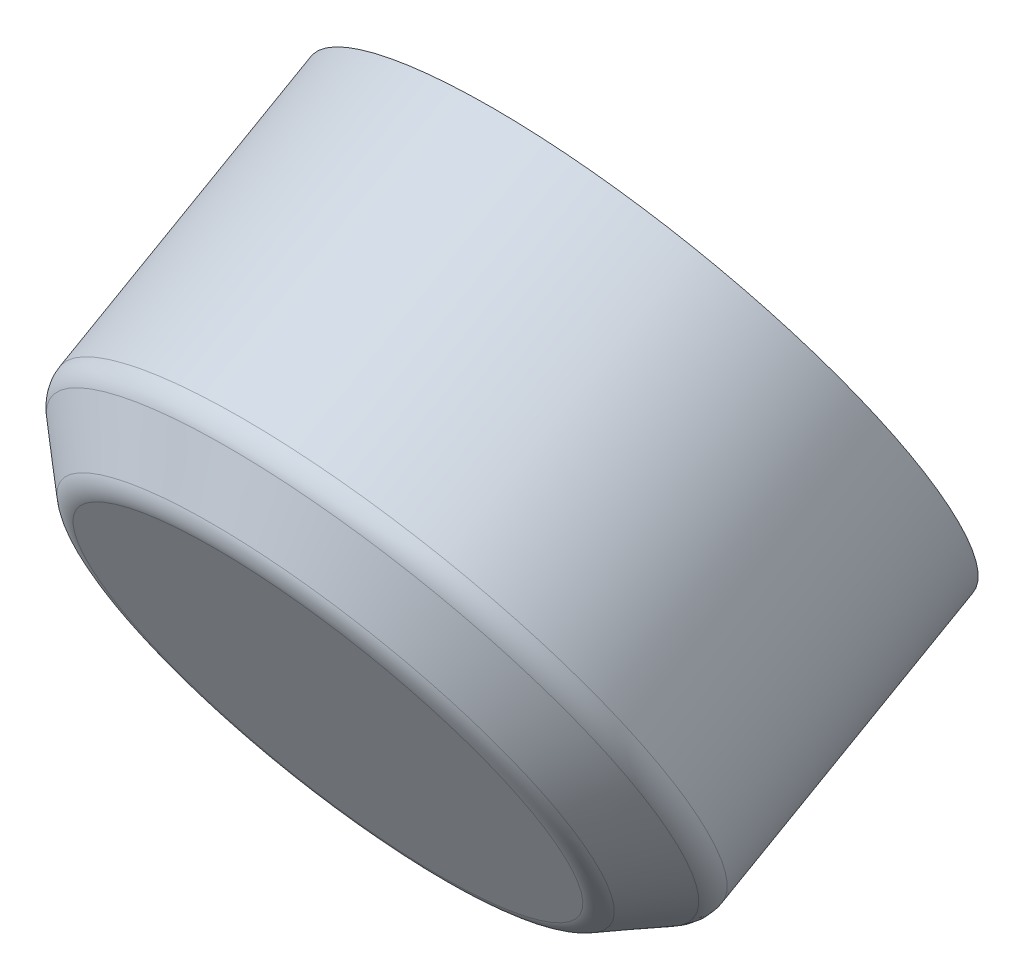
ISO-10303-21;
HEADER;
FILE_DESCRIPTION(('STEP AP214'),'2;1');
FILE_NAME('part.step','',(''),(''),'','','');
FILE_SCHEMA(('AUTOMOTIVE_DESIGN { 1 0 10303 214 1 1 1 1 }'));
ENDSEC;
DATA;
#1=APPLICATION_CONTEXT('core data for automotive mechanical design processes');
#2=APPLICATION_PROTOCOL_DEFINITION('international standard','automotive_design',2000,#1);
#3=PRODUCT_CONTEXT('',#1,'mechanical');
#4=PRODUCT('Part','Part','',(#3));
#5=PRODUCT_RELATED_PRODUCT_CATEGORY('part','',(#4));
#6=PRODUCT_DEFINITION_FORMATION('','',#4);
#7=PRODUCT_DEFINITION_CONTEXT('part definition',#1,'design');
#8=PRODUCT_DEFINITION('design','',#6,#7);
#9=PRODUCT_DEFINITION_SHAPE('','',#8);
#10=(LENGTH_UNIT() NAMED_UNIT(*) SI_UNIT(.MILLI.,.METRE.));
#11=(NAMED_UNIT(*) PLANE_ANGLE_UNIT() SI_UNIT($,.RADIAN.));
#12=(NAMED_UNIT(*) SI_UNIT($,.STERADIAN.) SOLID_ANGLE_UNIT());
#13=UNCERTAINTY_MEASURE_WITH_UNIT(LENGTH_MEASURE(1.E-05),#10,'distance_accuracy_value','');
#14=(GEOMETRIC_REPRESENTATION_CONTEXT(3) GLOBAL_UNCERTAINTY_ASSIGNED_CONTEXT((#13)) GLOBAL_UNIT_ASSIGNED_CONTEXT((#10,
#11,#12)) REPRESENTATION_CONTEXT('',''));
#15=CARTESIAN_POINT('',(0.,0.,0.));
#16=DIRECTION('',(0.,0.,1.));
#17=DIRECTION('',(1.,0.,0.));
#18=AXIS2_PLACEMENT_3D('',#15,#16,#17);
#19=CARTESIAN_POINT('',(0.,26.5724826817115,58.774079964931));
#20=DIRECTION('',(0.,0.494736971942381,-0.869042765687215));
#21=DIRECTION('',(0.,0.869042765687215,0.494736971942381));
#22=AXIS2_PLACEMENT_3D('',#19,#20,#21);
#23=CYLINDRICAL_SURFACE('',#22,4.);
#24=CARTESIAN_POINT('',(0.,30.0356414853082,52.6907806051205));
#25=DIRECTION('',(0.,0.494736971942381,-0.869042765687215));
#26=DIRECTION('',(0.,0.869042765687215,0.494736971942381));
#27=AXIS2_PLACEMENT_3D('',#24,#25,#26);
#28=CIRCLE('',#27,4.);
#29=CARTESIAN_POINT('',(0.,33.5118125480571,54.66972849289));
#30=VERTEX_POINT('',#29);
#31=EDGE_CURVE('E131',#30,#30,#28,.T.);
#32=ORIENTED_EDGE('',*,*,#31,.T.);
#33=EDGE_LOOP('',(#32));
#34=FACE_BOUND('',#33,.T.);
#35=CARTESIAN_POINT('',(0.,28.9224832984378,54.6461268279167));
#36=DIRECTION('',(0.,-0.494736971942379,0.869042765687216));
#37=DIRECTION('',(0.,-0.869042765687216,-0.494736971942379));
#38=AXIS2_PLACEMENT_3D('',#35,#36,#37);
#39=CIRCLE('',#38,4.);
#40=CARTESIAN_POINT('',(0.,25.446312235689,52.6671789401472));
#41=VERTEX_POINT('',#40);
#42=EDGE_CURVE('E144',#41,#41,#39,.F.);
#43=ORIENTED_EDGE('',*,*,#42,.F.);
#44=EDGE_LOOP('',(#43));
#45=FACE_BOUND('',#44,.T.);
#46=ADVANCED_FACE('F45',(#34,#45),#23,.F.);
#47=CARTESIAN_POINT('',(0.,30.0356414853082,52.6907806051205));
#48=DIRECTION('',(0.,-0.494736971942381,0.869042765687215));
#49=DIRECTION('',(0.,-0.869042765687215,-0.494736971942381));
#50=AXIS2_PLACEMENT_3D('',#47,#48,#49);
#51=CYLINDRICAL_SURFACE('',#50,10.);
#52=CARTESIAN_POINT('',(0.,25.2931985294703,61.0212389621628));
#53=DIRECTION('',(0.,-0.494736971942381,0.869042765687215));
#54=DIRECTION('',(0.,-0.869042765687215,-0.494736971942381));
#55=AXIS2_PLACEMENT_3D('',#52,#53,#54);
#56=CIRCLE('',#55,10.);
#57=CARTESIAN_POINT('',(0.,16.6027708725982,56.073869242739));
#58=VERTEX_POINT('',#57);
#59=EDGE_CURVE('E137',#58,#58,#56,.F.);
#60=ORIENTED_EDGE('',*,*,#59,.T.);
#61=EDGE_LOOP('',(#60));
#62=FACE_BOUND('',#61,.T.);
#63=CARTESIAN_POINT('',(0.,30.0356414853082,52.6907806051205));
#64=DIRECTION('',(0.,-0.494736971942381,0.869042765687215));
#65=DIRECTION('',(0.,-0.869042765687215,-0.494736971942381));
#66=AXIS2_PLACEMENT_3D('',#63,#64,#65);
#67=CIRCLE('',#66,10.);
#68=CARTESIAN_POINT('',(0.,21.3452138284361,47.7434108856967));
#69=VERTEX_POINT('',#68);
#70=EDGE_CURVE('E134',#69,#69,#67,.T.);
#71=ORIENTED_EDGE('',*,*,#70,.T.);
#72=EDGE_LOOP('',(#71));
#73=FACE_BOUND('',#72,.T.);
#74=ADVANCED_FACE('F199',(#62,#73),#51,.T.);
#75=CARTESIAN_POINT('',(0.,30.0356414853082,52.6907806051205));
#76=DIRECTION('',(0.,-0.494736971942381,0.869042765687215));
#77=DIRECTION('',(0.,-0.869042765687215,-0.494736971942381));
#78=AXIS2_PLACEMENT_3D('',#75,#76,#77);
#79=PLANE('',#78);
#80=ORIENTED_EDGE('',*,*,#31,.F.);
#81=EDGE_LOOP('',(#80));
#82=FACE_BOUND('',#81,.T.);
#83=ORIENTED_EDGE('',*,*,#70,.F.);
#84=EDGE_LOOP('',(#83));
#85=FACE_BOUND('',#84,.T.);
#86=ADVANCED_FACE('F207',(#82,#85),#79,.F.);
#87=CARTESIAN_POINT('',(0.,24.0987978219996,63.1192937933671));
#88=DIRECTION('',(0.,-0.494736971942381,0.869042765687215));
#89=DIRECTION('',(0.,-0.869042765687215,-0.494736971942381));
#90=AXIS2_PLACEMENT_3D('',#87,#88,#89);
#91=PLANE('',#90);
#92=CARTESIAN_POINT('',(0.,24.0987978219996,63.1192937933671));
#93=DIRECTION('',(0.,-0.494736971942381,0.869042765687215));
#94=DIRECTION('',(0.,-0.869042765687215,-0.494736971942381));
#95=AXIS2_PLACEMENT_3D('',#92,#93,#94);
#96=CIRCLE('',#95,7.58578643762691);
#97=CARTESIAN_POINT('',(0.,17.5064249963318,59.366324781414));
#98=VERTEX_POINT('',#97);
#99=EDGE_CURVE('E11',#98,#98,#96,.T.);
#100=ORIENTED_EDGE('',*,*,#99,.T.);
#101=EDGE_LOOP('',(#100));
#102=FACE_BOUND('',#101,.T.);
#103=ADVANCED_FACE('F219',(#102),#91,.T.);
#104=CARTESIAN_POINT('',(0.,24.0987978219996,63.1192937933671));
#105=DIRECTION('',(0.,0.494736971942381,-0.869042765687215));
#106=DIRECTION('',(0.,0.869042765687215,0.494736971942381));
#107=AXIS2_PLACEMENT_3D('',#104,#105,#106);
#108=CONICAL_SURFACE('',#107,8.,0.785398163397443);
#109=CARTESIAN_POINT('',(0.,24.9433666617062,61.6357449949213));
#110=DIRECTION('',(0.,-0.494736971942381,0.869042765687215));
#111=DIRECTION('',(0.,-0.869042765687215,-0.494736971942381));
#112=AXIS2_PLACEMENT_3D('',#109,#110,#111);
#113=CIRCLE('',#112,9.70710678118656);
#114=CARTESIAN_POINT('',(0.,16.5074757377627,56.8332803796757));
#115=VERTEX_POINT('',#114);
#116=EDGE_CURVE('E55',#115,#115,#113,.T.);
#117=ORIENTED_EDGE('',*,*,#116,.T.);
#118=EDGE_LOOP('',(#117));
#119=FACE_BOUND('',#118,.T.);
#120=CARTESIAN_POINT('',(0.,24.2437029261779,62.8647570604384));
#121=DIRECTION('',(0.,-0.494736971942381,0.869042765687215));
#122=DIRECTION('',(0.,-0.869042765687215,-0.494736971942381));
#123=AXIS2_PLACEMENT_3D('',#120,#121,#122);
#124=CIRCLE('',#123,8.29289321881346);
#125=CARTESIAN_POINT('',(0.,17.0368240677515,58.7619561807211));
#126=VERTEX_POINT('',#125);
#127=EDGE_CURVE('E140',#126,#126,#124,.F.);
#128=ORIENTED_EDGE('',*,*,#127,.T.);
#129=EDGE_LOOP('',(#128));
#130=FACE_BOUND('',#129,.T.);
#131=ADVANCED_FACE('F222',(#119,#130),#108,.T.);
#132=CARTESIAN_POINT('',(0.,25.2931985294703,61.0212389621628));
#133=DIRECTION('',(0.,-0.494736971942381,0.869042765687215));
#134=DIRECTION('',(0.,-0.869042765687215,-0.494736971942381));
#135=AXIS2_PLACEMENT_3D('',#132,#133,#134);
#136=TOROIDAL_SURFACE('',#135,9.00000000000001,1.);
#137=ORIENTED_EDGE('',*,*,#116,.F.);
#138=EDGE_LOOP('',(#137));
#139=FACE_BOUND('',#138,.T.);
#140=ORIENTED_EDGE('',*,*,#59,.F.);
#141=EDGE_LOOP('',(#140));
#142=FACE_BOUND('',#141,.T.);
#143=ADVANCED_FACE('F231',(#139,#142),#136,.T.);
#144=CARTESIAN_POINT('',(0.,24.593534793942,62.2502510276799));
#145=DIRECTION('',(0.,-0.494736971942381,0.869042765687215));
#146=DIRECTION('',(0.,-0.869042765687215,-0.494736971942381));
#147=AXIS2_PLACEMENT_3D('',#144,#145,#146);
#148=TOROIDAL_SURFACE('',#147,7.58578643762691,1.);
#149=ORIENTED_EDGE('',*,*,#127,.F.);
#150=EDGE_LOOP('',(#149));
#151=FACE_BOUND('',#150,.T.);
#152=ORIENTED_EDGE('',*,*,#99,.F.);
#153=EDGE_LOOP('',(#152));
#154=FACE_BOUND('',#153,.T.);
#155=ADVANCED_FACE('F47',(#151,#154),#148,.T.);
#156=CARTESIAN_POINT('',(0.,-16.4157682141171,28.835533664822));
#157=DIRECTION('',(0.,-0.494736971942379,0.869042765687216));
#158=DIRECTION('',(0.,-0.869042765687216,-0.494736971942379));
#159=AXIS2_PLACEMENT_3D('',#156,#157,#158);
#160=PLANE('',#159);
#161=DIRECTION('',(0.,0.869042765687216,0.494736971942379));
#162=VECTOR('',#161,1.);
#163=CARTESIAN_POINT('',(6.31217782649106,25.8808336185326,52.9145474261184));
#164=LINE('',#163,#162);
#165=CARTESIAN_POINT('',(6.31217782649106,25.7553980998559,52.8431382951362));
#166=VERTEX_POINT('',#165);
#167=CARTESIAN_POINT('',(6.31217782649106,32.0895684970198,56.4491153606973));
#168=VERTEX_POINT('',#167);
#169=EDGE_CURVE('E99',#166,#168,#164,.T.);
#170=ORIENTED_EDGE('',*,*,#169,.T.);
#171=DIRECTION('',(-0.866025403784439,0.434521382843608,0.247368485971189));
#172=VECTOR('',#171,1.);
#173=CARTESIAN_POINT('',(6.18717782649106,32.1522862563582,56.4848199261884));
#174=LINE('',#173,#172);
#175=CARTESIAN_POINT('',(0.,35.2566536956018,58.2521038934779));
#176=VERTEX_POINT('',#175);
#177=EDGE_CURVE('E89',#168,#176,#174,.T.);
#178=ORIENTED_EDGE('',*,*,#177,.T.);
#179=DIRECTION('',(-0.866025403784439,-0.434521382843608,-0.24736848597119));
#180=VECTOR('',#179,1.);
#181=CARTESIAN_POINT('',(-0.124999999999999,35.1939359362634,58.2163993279868));
#182=LINE('',#181,#180);
#183=CARTESIAN_POINT('',(-6.31217782649106,32.0895684970198,56.4491153606973));
#184=VERTEX_POINT('',#183);
#185=EDGE_CURVE('E96',#176,#184,#182,.T.);
#186=ORIENTED_EDGE('',*,*,#185,.T.);
#187=DIRECTION('',(0.,-0.869042765687216,-0.494736971942379));
#188=VECTOR('',#187,1.);
#189=CARTESIAN_POINT('',(-6.31217782649106,31.9641329783431,56.3777062297151));
#190=LINE('',#189,#188);
#191=CARTESIAN_POINT('',(-6.31217782649106,25.7553980998559,52.8431382951362));
#192=VERTEX_POINT('',#191);
#193=EDGE_CURVE('E117',#184,#192,#190,.T.);
#194=ORIENTED_EDGE('',*,*,#193,.T.);
#195=DIRECTION('',(0.866025403784438,-0.434521382843609,-0.247368485971189));
#196=VECTOR('',#195,1.);
#197=CARTESIAN_POINT('',(-6.18717782649106,25.6926803405175,52.807433729645));
#198=LINE('',#197,#196);
#199=CARTESIAN_POINT('',(0.,22.5883129012739,51.0401497623556));
#200=VERTEX_POINT('',#199);
#201=EDGE_CURVE('E119',#192,#200,#198,.T.);
#202=ORIENTED_EDGE('',*,*,#201,.T.);
#203=DIRECTION('',(0.866025403784439,0.434521382843608,0.24736848597119));
#204=VECTOR('',#203,1.);
#205=CARTESIAN_POINT('',(0.124999999999997,22.6510306606123,51.0758543278467));
#206=LINE('',#205,#204);
#207=EDGE_CURVE('E155',#200,#166,#206,.T.);
#208=ORIENTED_EDGE('',*,*,#207,.T.);
#209=EDGE_LOOP('',(#170,#178,#186,#194,#202,#208));
#210=FACE_BOUND('',#209,.T.);
#211=ORIENTED_EDGE('',*,*,#42,.T.);
#212=EDGE_LOOP('',(#211));
#213=FACE_BOUND('',#212,.T.);
#214=ADVANCED_FACE('F93',(#210,#213),#160,.T.);
#215=CARTESIAN_POINT('',(0.,-20.126295503685,35.3533544074761));
#216=DIRECTION('',(0.,-0.494736971942379,0.869042765687216));
#217=DIRECTION('',(0.,-0.869042765687216,-0.494736971942379));
#218=AXIS2_PLACEMENT_3D('',#215,#216,#217);
#219=PLANE('',#218);
#220=DIRECTION('',(0.,0.869042765687216,0.494736971942379));
#221=VECTOR('',#220,1.);
#222=CARTESIAN_POINT('',(6.31217782649106,22.1703063289647,59.4323681687725));
#223=LINE('',#222,#221);
#224=CARTESIAN_POINT('',(6.31217782649106,22.044870810288,59.3609590377903));
#225=VERTEX_POINT('',#224);
#226=CARTESIAN_POINT('',(6.31217782649106,28.379041207452,62.9669361033514));
#227=VERTEX_POINT('',#226);
#228=EDGE_CURVE('E156',#225,#227,#223,.T.);
#229=ORIENTED_EDGE('',*,*,#228,.F.);
#230=DIRECTION('',(0.866025403784439,0.434521382843608,0.24736848597119));
#231=VECTOR('',#230,1.);
#232=CARTESIAN_POINT('',(0.124999999999996,18.9405033710444,57.5936750705008));
#233=LINE('',#232,#231);
#234=CARTESIAN_POINT('',(0.,18.8777856117061,57.5579705050097));
#235=VERTEX_POINT('',#234);
#236=EDGE_CURVE('E64',#235,#225,#233,.T.);
#237=ORIENTED_EDGE('',*,*,#236,.F.);
#238=DIRECTION('',(0.866025403784438,-0.434521382843609,-0.247368485971189));
#239=VECTOR('',#238,1.);
#240=CARTESIAN_POINT('',(-6.18717782649106,21.9821530509497,59.3252544722992));
#241=LINE('',#240,#239);
#242=CARTESIAN_POINT('',(-6.31217782649106,22.044870810288,59.3609590377903));
#243=VERTEX_POINT('',#242);
#244=EDGE_CURVE('E163',#243,#235,#241,.T.);
#245=ORIENTED_EDGE('',*,*,#244,.F.);
#246=DIRECTION('',(0.,-0.869042765687216,-0.494736971942379));
#247=VECTOR('',#246,1.);
#248=CARTESIAN_POINT('',(-6.31217782649106,28.2536056887753,62.8955269723692));
#249=LINE('',#248,#247);
#250=CARTESIAN_POINT('',(-6.31217782649106,28.379041207452,62.9669361033514));
#251=VERTEX_POINT('',#250);
#252=EDGE_CURVE('E174',#251,#243,#249,.T.);
#253=ORIENTED_EDGE('',*,*,#252,.F.);
#254=DIRECTION('',(-0.866025403784439,-0.434521382843608,-0.24736848597119));
#255=VECTOR('',#254,1.);
#256=CARTESIAN_POINT('',(-0.125000000000001,31.4834086466956,64.7342200706409));
#257=LINE('',#256,#255);
#258=CARTESIAN_POINT('',(0.,31.5461264060339,64.769924636132));
#259=VERTEX_POINT('',#258);
#260=EDGE_CURVE('E177',#259,#251,#257,.T.);
#261=ORIENTED_EDGE('',*,*,#260,.F.);
#262=DIRECTION('',(-0.866025403784439,0.434521382843608,0.247368485971189));
#263=VECTOR('',#262,1.);
#264=CARTESIAN_POINT('',(6.18717782649106,28.4417589667903,63.0026406688426));
#265=LINE('',#264,#263);
#266=EDGE_CURVE('E107',#227,#259,#265,.T.);
#267=ORIENTED_EDGE('',*,*,#266,.F.);
#268=EDGE_LOOP('',(#229,#237,#245,#253,#261,#267));
#269=FACE_BOUND('',#268,.T.);
#270=CARTESIAN_POINT('',(0.,25.21195600887,61.1639475705708));
#271=DIRECTION('',(0.,-0.494736971942379,0.869042765687216));
#272=DIRECTION('',(0.,-0.869042765687216,-0.494736971942379));
#273=AXIS2_PLACEMENT_3D('',#270,#271,#272);
#274=CIRCLE('',#273,3.75000000000001);
#275=CARTESIAN_POINT('',(0.,21.9530456375429,59.3086839257869));
#276=VERTEX_POINT('',#275);
#277=EDGE_CURVE('E167',#276,#276,#274,.T.);
#278=ORIENTED_EDGE('',*,*,#277,.T.);
#279=EDGE_LOOP('',(#278));
#280=FACE_BOUND('',#279,.T.);
#281=ADVANCED_FACE('F182',(#269,#280),#219,.F.);
#282=CARTESIAN_POINT('',(6.31217782649106,22.2939905719503,59.2151074773507));
#283=DIRECTION('',(-1.,0.,0.));
#284=DIRECTION('',(0.,0.,1.));
#285=AXIS2_PLACEMENT_3D('',#282,#283,#284);
#286=PLANE('',#285);
#287=ORIENTED_EDGE('',*,*,#169,.F.);
#288=DIRECTION('',(0.,0.494736971942379,-0.869042765687216));
#289=VECTOR('',#288,1.);
#290=CARTESIAN_POINT('',(6.31217782649106,22.1685550532736,59.1436983463685));
#291=LINE('',#290,#289);
#292=EDGE_CURVE('E130',#225,#166,#291,.T.);
#293=ORIENTED_EDGE('',*,*,#292,.F.);
#294=ORIENTED_EDGE('',*,*,#228,.T.);
#295=DIRECTION('',(0.,0.494736971942379,-0.869042765687216));
#296=VECTOR('',#295,1.);
#297=CARTESIAN_POINT('',(6.31217782649106,28.5027254504375,62.7496754119296));
#298=LINE('',#297,#296);
#299=EDGE_CURVE('E111',#227,#168,#298,.T.);
#300=ORIENTED_EDGE('',*,*,#299,.T.);
#301=EDGE_LOOP('',(#287,#293,#294,#300));
#302=FACE_BOUND('',#301,.T.);
#303=ADVANCED_FACE('F166',(#302),#286,.T.);
#304=CARTESIAN_POINT('',(6.18717782649106,28.5654432097759,62.7853799774208));
#305=DIRECTION('',(-0.5,-0.752613112060217,-0.42845478589349));
#306=DIRECTION('',(0.832939072330605,-0.553364709558742,0.));
#307=AXIS2_PLACEMENT_3D('',#304,#305,#306);
#308=PLANE('',#307);
#309=ORIENTED_EDGE('',*,*,#177,.F.);
#310=ORIENTED_EDGE('',*,*,#299,.F.);
#311=ORIENTED_EDGE('',*,*,#266,.T.);
#312=DIRECTION('',(0.,0.494736971942379,-0.869042765687216));
#313=VECTOR('',#312,1.);
#314=CARTESIAN_POINT('',(0.,31.6698106490195,64.5526639447102));
#315=LINE('',#314,#313);
#316=EDGE_CURVE('E103',#259,#176,#315,.T.);
#317=ORIENTED_EDGE('',*,*,#316,.T.);
#318=EDGE_LOOP('',(#309,#310,#311,#317));
#319=FACE_BOUND('',#318,.T.);
#320=ADVANCED_FACE('F104',(#319),#308,.T.);
#321=CARTESIAN_POINT('',(-0.125000000000001,31.6070928896812,64.5169593792191));
#322=DIRECTION('',(0.5,-0.752613112060217,-0.42845478589349));
#323=DIRECTION('',(0.832939072330605,0.553364709558742,0.));
#324=AXIS2_PLACEMENT_3D('',#321,#322,#323);
#325=PLANE('',#324);
#326=ORIENTED_EDGE('',*,*,#185,.F.);
#327=ORIENTED_EDGE('',*,*,#316,.F.);
#328=ORIENTED_EDGE('',*,*,#260,.T.);
#329=DIRECTION('',(0.,0.494736971942379,-0.869042765687216));
#330=VECTOR('',#329,1.);
#331=CARTESIAN_POINT('',(-6.31217782649106,28.5027254504376,62.7496754119296));
#332=LINE('',#331,#330);
#333=EDGE_CURVE('E112',#251,#184,#332,.T.);
#334=ORIENTED_EDGE('',*,*,#333,.T.);
#335=EDGE_LOOP('',(#326,#327,#328,#334));
#336=FACE_BOUND('',#335,.T.);
#337=ADVANCED_FACE('F114',(#336),#325,.T.);
#338=CARTESIAN_POINT('',(-6.31217782649106,28.3772899317608,62.6782662809474));
#339=DIRECTION('',(1.,0.,0.));
#340=DIRECTION('',(0.,1.,0.));
#341=AXIS2_PLACEMENT_3D('',#338,#339,#340);
#342=PLANE('',#341);
#343=ORIENTED_EDGE('',*,*,#193,.F.);
#344=ORIENTED_EDGE('',*,*,#333,.F.);
#345=ORIENTED_EDGE('',*,*,#252,.T.);
#346=DIRECTION('',(0.,0.494736971942379,-0.869042765687216));
#347=VECTOR('',#346,1.);
#348=CARTESIAN_POINT('',(-6.31217782649106,22.1685550532736,59.1436983463685));
#349=LINE('',#348,#347);
#350=EDGE_CURVE('E124',#243,#192,#349,.T.);
#351=ORIENTED_EDGE('',*,*,#350,.T.);
#352=EDGE_LOOP('',(#343,#344,#345,#351));
#353=FACE_BOUND('',#352,.T.);
#354=ADVANCED_FACE('F188',(#353),#342,.T.);
#355=CARTESIAN_POINT('',(-6.18717782649106,22.1058372939353,59.1079937808774));
#356=DIRECTION('',(0.5,0.752613112060216,0.428454785893489));
#357=DIRECTION('',(-0.832939072330605,0.553364709558742,0.));
#358=AXIS2_PLACEMENT_3D('',#355,#356,#357);
#359=PLANE('',#358);
#360=ORIENTED_EDGE('',*,*,#201,.F.);
#361=ORIENTED_EDGE('',*,*,#350,.F.);
#362=ORIENTED_EDGE('',*,*,#244,.T.);
#363=DIRECTION('',(0.,0.494736971942379,-0.869042765687216));
#364=VECTOR('',#363,1.);
#365=CARTESIAN_POINT('',(0.,19.0014698546917,57.3407098135879));
#366=LINE('',#365,#364);
#367=EDGE_CURVE('E127',#235,#200,#366,.T.);
#368=ORIENTED_EDGE('',*,*,#367,.T.);
#369=EDGE_LOOP('',(#360,#361,#362,#368));
#370=FACE_BOUND('',#369,.T.);
#371=ADVANCED_FACE('F161',(#370),#359,.T.);
#372=CARTESIAN_POINT('',(0.124999999999996,19.06418761403,57.376414379079));
#373=DIRECTION('',(-0.5,0.752613112060217,0.42845478589349));
#374=DIRECTION('',(-0.832939072330605,-0.553364709558742,0.));
#375=AXIS2_PLACEMENT_3D('',#372,#373,#374);
#376=PLANE('',#375);
#377=ORIENTED_EDGE('',*,*,#207,.F.);
#378=ORIENTED_EDGE('',*,*,#367,.F.);
#379=ORIENTED_EDGE('',*,*,#236,.T.);
#380=ORIENTED_EDGE('',*,*,#292,.T.);
#381=EDGE_LOOP('',(#377,#378,#379,#380));
#382=FACE_BOUND('',#381,.T.);
#383=ADVANCED_FACE('F164',(#382),#376,.T.);
#384=CARTESIAN_POINT('',(0.,25.3356402518556,60.946686879149));
#385=DIRECTION('',(0.,0.494736971942379,-0.869042765687216));
#386=DIRECTION('',(0.,0.869042765687216,0.494736971942379));
#387=AXIS2_PLACEMENT_3D('',#384,#385,#386);
#388=CYLINDRICAL_SURFACE('',#387,3.75000000000001);
#389=CARTESIAN_POINT('',(0.,25.3356402518556,60.946686879149));
#390=DIRECTION('',(0.,0.49473697194238,-0.869042765687216));
#391=DIRECTION('',(0.,0.869042765687216,0.49473697194238));
#392=AXIS2_PLACEMENT_3D('',#389,#390,#391);
#393=CIRCLE('',#392,3.75000000000001);
#394=CARTESIAN_POINT('',(0.,28.5945506231826,62.801950523933));
#395=VERTEX_POINT('',#394);
#396=EDGE_CURVE('E49',#395,#395,#393,.F.);
#397=ORIENTED_EDGE('',*,*,#396,.T.);
#398=EDGE_LOOP('',(#397));
#399=FACE_BOUND('',#398,.T.);
#400=ORIENTED_EDGE('',*,*,#277,.F.);
#401=EDGE_LOOP('',(#400));
#402=FACE_BOUND('',#401,.T.);
#403=ADVANCED_FACE('F213',(#399,#402),#388,.T.);
#404=CARTESIAN_POINT('',(0.,-20.0026112606993,35.1360937160542));
#405=DIRECTION('',(0.,0.49473697194238,-0.869042765687216));
#406=DIRECTION('',(0.,0.869042765687216,0.49473697194238));
#407=AXIS2_PLACEMENT_3D('',#404,#405,#406);
#408=PLANE('',#407);
#409=ORIENTED_EDGE('',*,*,#396,.F.);
#410=EDGE_LOOP('',(#409));
#411=FACE_BOUND('',#410,.T.);
#412=ADVANCED_FACE('F215',(#411),#408,.T.);
#413=CLOSED_SHELL('',(#46,#74,#86,#103,#131,#143,#155,#214,#281,#303,#320,#337,#354,#371,#383,
#403,#412));
#414=MANIFOLD_SOLID_BREP('B2',#413);
#415=ADVANCED_BREP_SHAPE_REPRESENTATION('',(#18,#414),#14);
#416=SHAPE_DEFINITION_REPRESENTATION(#9,#415);
ENDSEC;
END-ISO-10303-21;
